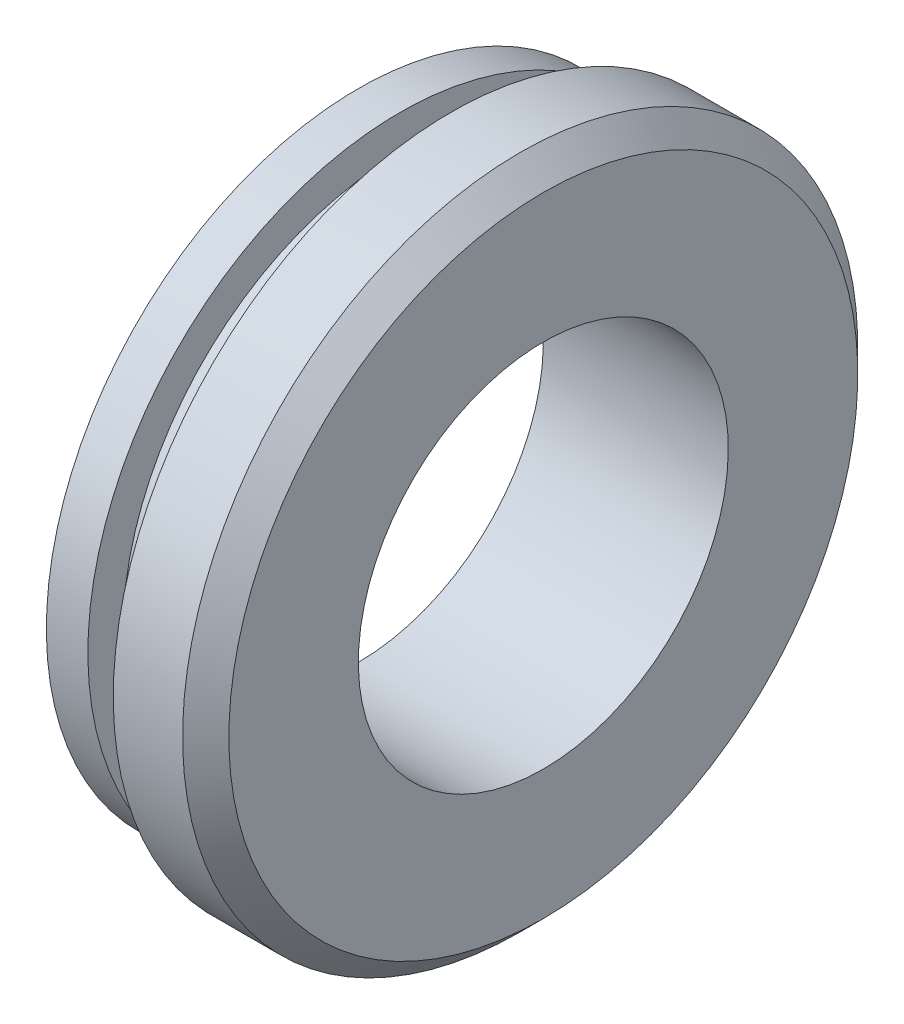
ISO-10303-21;
HEADER;
FILE_DESCRIPTION(('STEP AP214'),'2;1');
FILE_NAME('part.step','',(''),(''),'','','');
FILE_SCHEMA(('AUTOMOTIVE_DESIGN { 1 0 10303 214 1 1 1 1 }'));
ENDSEC;
DATA;
#1=APPLICATION_CONTEXT('core data for automotive mechanical design processes');
#2=APPLICATION_PROTOCOL_DEFINITION('international standard','automotive_design',2000,#1);
#3=PRODUCT_CONTEXT('',#1,'mechanical');
#4=PRODUCT('Part','Part','',(#3));
#5=PRODUCT_RELATED_PRODUCT_CATEGORY('part','',(#4));
#6=PRODUCT_DEFINITION_FORMATION('','',#4);
#7=PRODUCT_DEFINITION_CONTEXT('part definition',#1,'design');
#8=PRODUCT_DEFINITION('design','',#6,#7);
#9=PRODUCT_DEFINITION_SHAPE('','',#8);
#10=(LENGTH_UNIT() NAMED_UNIT(*) SI_UNIT(.MILLI.,.METRE.));
#11=(NAMED_UNIT(*) PLANE_ANGLE_UNIT() SI_UNIT($,.RADIAN.));
#12=(NAMED_UNIT(*) SI_UNIT($,.STERADIAN.) SOLID_ANGLE_UNIT());
#13=UNCERTAINTY_MEASURE_WITH_UNIT(LENGTH_MEASURE(1.E-05),#10,'distance_accuracy_value','');
#14=(GEOMETRIC_REPRESENTATION_CONTEXT(3) GLOBAL_UNCERTAINTY_ASSIGNED_CONTEXT((#13)) GLOBAL_UNIT_ASSIGNED_CONTEXT((#10,
#11,#12)) REPRESENTATION_CONTEXT('',''));
#15=CARTESIAN_POINT('',(0.,0.,0.));
#16=DIRECTION('',(0.,0.,1.));
#17=DIRECTION('',(1.,0.,0.));
#18=AXIS2_PLACEMENT_3D('',#15,#16,#17);
#19=CARTESIAN_POINT('',(14.5,0.,0.));
#20=DIRECTION('',(-1.,0.,0.));
#21=DIRECTION('',(0.,-1.,0.));
#22=AXIS2_PLACEMENT_3D('',#19,#20,#21);
#23=PLANE('',#22);
#24=CARTESIAN_POINT('',(14.5,0.,0.));
#25=DIRECTION('',(-1.,0.,0.));
#26=DIRECTION('',(0.,-1.,0.));
#27=AXIS2_PLACEMENT_3D('',#24,#25,#26);
#28=CIRCLE('',#27,7.3);
#29=CARTESIAN_POINT('',(14.5,-7.3,0.));
#30=VERTEX_POINT('',#29);
#31=EDGE_CURVE('E70',#30,#30,#28,.T.);
#32=ORIENTED_EDGE('',*,*,#31,.T.);
#33=EDGE_LOOP('',(#32));
#34=FACE_BOUND('',#33,.T.);
#35=CARTESIAN_POINT('',(14.5,0.,0.));
#36=DIRECTION('',(-1.,0.,0.));
#37=DIRECTION('',(0.,-1.,0.));
#38=AXIS2_PLACEMENT_3D('',#35,#36,#37);
#39=CIRCLE('',#38,5.99099126868528);
#40=CARTESIAN_POINT('',(14.5,-5.99099126868528,0.));
#41=VERTEX_POINT('',#40);
#42=EDGE_CURVE('E49',#41,#41,#39,.T.);
#43=ORIENTED_EDGE('',*,*,#42,.F.);
#44=EDGE_LOOP('',(#43));
#45=FACE_BOUND('',#44,.T.);
#46=ADVANCED_FACE('F37',(#34,#45),#23,.T.);
#47=CARTESIAN_POINT('',(0.,0.,0.));
#48=DIRECTION('',(-1.,0.,0.));
#49=DIRECTION('',(0.,-1.,0.));
#50=AXIS2_PLACEMENT_3D('',#47,#48,#49);
#51=CYLINDRICAL_SURFACE('',#50,5.99099126868528);
#52=ORIENTED_EDGE('',*,*,#42,.T.);
#53=EDGE_LOOP('',(#52));
#54=FACE_BOUND('',#53,.T.);
#55=CARTESIAN_POINT('',(13.3973546696229,0.,0.));
#56=DIRECTION('',(-1.,0.,0.));
#57=DIRECTION('',(0.,-1.,0.));
#58=AXIS2_PLACEMENT_3D('',#55,#56,#57);
#59=CIRCLE('',#58,5.99099126868528);
#60=CARTESIAN_POINT('',(13.3973546696229,-5.99099126868528,0.));
#61=VERTEX_POINT('',#60);
#62=EDGE_CURVE('E53',#61,#61,#59,.T.);
#63=ORIENTED_EDGE('',*,*,#62,.F.);
#64=EDGE_LOOP('',(#63));
#65=FACE_BOUND('',#64,.T.);
#66=ADVANCED_FACE('F88',(#54,#65),#51,.T.);
#67=CARTESIAN_POINT('',(13.3973546696229,0.,0.));
#68=DIRECTION('',(1.,0.,0.));
#69=DIRECTION('',(0.,1.,0.));
#70=AXIS2_PLACEMENT_3D('',#67,#68,#69);
#71=PLANE('',#70);
#72=ORIENTED_EDGE('',*,*,#62,.T.);
#73=EDGE_LOOP('',(#72));
#74=FACE_BOUND('',#73,.T.);
#75=CARTESIAN_POINT('',(13.3973546696229,0.,0.));
#76=DIRECTION('',(-1.,0.,0.));
#77=DIRECTION('',(0.,-1.,0.));
#78=AXIS2_PLACEMENT_3D('',#75,#76,#77);
#79=CIRCLE('',#78,6.74628690489476);
#80=CARTESIAN_POINT('',(13.3973546696229,-6.74628690489476,0.));
#81=VERTEX_POINT('',#80);
#82=EDGE_CURVE('E58',#81,#81,#79,.T.);
#83=ORIENTED_EDGE('',*,*,#82,.F.);
#84=EDGE_LOOP('',(#83));
#85=FACE_BOUND('',#84,.T.);
#86=ADVANCED_FACE('F92',(#74,#85),#71,.T.);
#87=CARTESIAN_POINT('',(0.,0.,0.));
#88=DIRECTION('',(-1.,0.,0.));
#89=DIRECTION('',(0.,-1.,0.));
#90=AXIS2_PLACEMENT_3D('',#87,#88,#89);
#91=CYLINDRICAL_SURFACE('',#90,6.74628690489476);
#92=ORIENTED_EDGE('',*,*,#82,.T.);
#93=EDGE_LOOP('',(#92));
#94=FACE_BOUND('',#93,.T.);
#95=CARTESIAN_POINT('',(12.5,0.,0.));
#96=DIRECTION('',(-1.,0.,0.));
#97=DIRECTION('',(0.,-1.,0.));
#98=AXIS2_PLACEMENT_3D('',#95,#96,#97);
#99=CIRCLE('',#98,6.74628690489476);
#100=CARTESIAN_POINT('',(12.5,-6.74628690489476,0.));
#101=VERTEX_POINT('',#100);
#102=EDGE_CURVE('E61',#101,#101,#99,.T.);
#103=ORIENTED_EDGE('',*,*,#102,.F.);
#104=EDGE_LOOP('',(#103));
#105=FACE_BOUND('',#104,.T.);
#106=ADVANCED_FACE('F98',(#94,#105),#91,.T.);
#107=CARTESIAN_POINT('',(12.5,0.,0.));
#108=DIRECTION('',(-1.,0.,0.));
#109=DIRECTION('',(0.,-1.,0.));
#110=AXIS2_PLACEMENT_3D('',#107,#108,#109);
#111=PLANE('',#110);
#112=ORIENTED_EDGE('',*,*,#102,.T.);
#113=EDGE_LOOP('',(#112));
#114=FACE_BOUND('',#113,.T.);
#115=CARTESIAN_POINT('',(12.5,0.,0.));
#116=DIRECTION('',(-1.,0.,0.));
#117=DIRECTION('',(0.,-1.,0.));
#118=AXIS2_PLACEMENT_3D('',#115,#116,#117);
#119=CIRCLE('',#118,4.);
#120=CARTESIAN_POINT('',(12.5,-4.,0.));
#121=VERTEX_POINT('',#120);
#122=EDGE_CURVE('E64',#121,#121,#119,.T.);
#123=ORIENTED_EDGE('',*,*,#122,.F.);
#124=EDGE_LOOP('',(#123));
#125=FACE_BOUND('',#124,.T.);
#126=ADVANCED_FACE('F102',(#114,#125),#111,.T.);
#127=CARTESIAN_POINT('',(0.,0.,0.));
#128=DIRECTION('',(-1.,0.,0.));
#129=DIRECTION('',(0.,-1.,0.));
#130=AXIS2_PLACEMENT_3D('',#127,#128,#129);
#131=CYLINDRICAL_SURFACE('',#130,4.);
#132=ORIENTED_EDGE('',*,*,#122,.T.);
#133=EDGE_LOOP('',(#132));
#134=FACE_BOUND('',#133,.T.);
#135=CARTESIAN_POINT('',(16.5,0.,0.));
#136=DIRECTION('',(-1.,0.,0.));
#137=DIRECTION('',(0.,-1.,0.));
#138=AXIS2_PLACEMENT_3D('',#135,#136,#137);
#139=CIRCLE('',#138,4.);
#140=CARTESIAN_POINT('',(16.5,-4.,0.));
#141=VERTEX_POINT('',#140);
#142=EDGE_CURVE('E67',#141,#141,#139,.T.);
#143=ORIENTED_EDGE('',*,*,#142,.F.);
#144=EDGE_LOOP('',(#143));
#145=FACE_BOUND('',#144,.T.);
#146=ADVANCED_FACE('F85',(#134,#145),#131,.F.);
#147=CARTESIAN_POINT('',(16.5,0.,0.));
#148=DIRECTION('',(1.,0.,0.));
#149=DIRECTION('',(0.,1.,0.));
#150=AXIS2_PLACEMENT_3D('',#147,#148,#149);
#151=PLANE('',#150);
#152=CARTESIAN_POINT('',(16.5,0.,0.));
#153=DIRECTION('',(1.,0.,0.));
#154=DIRECTION('',(0.,1.,0.));
#155=AXIS2_PLACEMENT_3D('',#152,#153,#154);
#156=CIRCLE('',#155,6.79999999999999);
#157=CARTESIAN_POINT('',(16.5,6.79999999999999,0.));
#158=VERTEX_POINT('',#157);
#159=EDGE_CURVE('E10',#158,#158,#156,.T.);
#160=ORIENTED_EDGE('',*,*,#159,.T.);
#161=EDGE_LOOP('',(#160));
#162=FACE_BOUND('',#161,.T.);
#163=ORIENTED_EDGE('',*,*,#142,.T.);
#164=EDGE_LOOP('',(#163));
#165=FACE_BOUND('',#164,.T.);
#166=ADVANCED_FACE('F78',(#162,#165),#151,.T.);
#167=CARTESIAN_POINT('',(0.,0.,0.));
#168=DIRECTION('',(-1.,0.,0.));
#169=DIRECTION('',(0.,-1.,0.));
#170=AXIS2_PLACEMENT_3D('',#167,#168,#169);
#171=CYLINDRICAL_SURFACE('',#170,7.3);
#172=CARTESIAN_POINT('',(16.,0.,0.));
#173=DIRECTION('',(1.,0.,0.));
#174=DIRECTION('',(0.,1.,0.));
#175=AXIS2_PLACEMENT_3D('',#172,#173,#174);
#176=CIRCLE('',#175,7.3);
#177=CARTESIAN_POINT('',(16.,7.3,0.));
#178=VERTEX_POINT('',#177);
#179=EDGE_CURVE('E45',#178,#178,#176,.F.);
#180=ORIENTED_EDGE('',*,*,#179,.T.);
#181=EDGE_LOOP('',(#180));
#182=FACE_BOUND('',#181,.T.);
#183=ORIENTED_EDGE('',*,*,#31,.F.);
#184=EDGE_LOOP('',(#183));
#185=FACE_BOUND('',#184,.T.);
#186=ADVANCED_FACE('F76',(#182,#185),#171,.T.);
#187=CARTESIAN_POINT('',(16.,0.,0.));
#188=DIRECTION('',(-1.,0.,0.));
#189=DIRECTION('',(0.,-1.,0.));
#190=AXIS2_PLACEMENT_3D('',#187,#188,#189);
#191=CONICAL_SURFACE('',#190,7.3,0.785398163397456);
#192=ORIENTED_EDGE('',*,*,#159,.F.);
#193=EDGE_LOOP('',(#192));
#194=FACE_BOUND('',#193,.T.);
#195=ORIENTED_EDGE('',*,*,#179,.F.);
#196=EDGE_LOOP('',(#195));
#197=FACE_BOUND('',#196,.T.);
#198=ADVANCED_FACE('F40',(#194,#197),#191,.T.);
#199=CLOSED_SHELL('',(#46,#66,#86,#106,#126,#146,#166,#186,#198));
#200=MANIFOLD_SOLID_BREP('B2',#199);
#201=ADVANCED_BREP_SHAPE_REPRESENTATION('',(#18,#200),#14);
#202=SHAPE_DEFINITION_REPRESENTATION(#9,#201);
ENDSEC;
END-ISO-10303-21;
